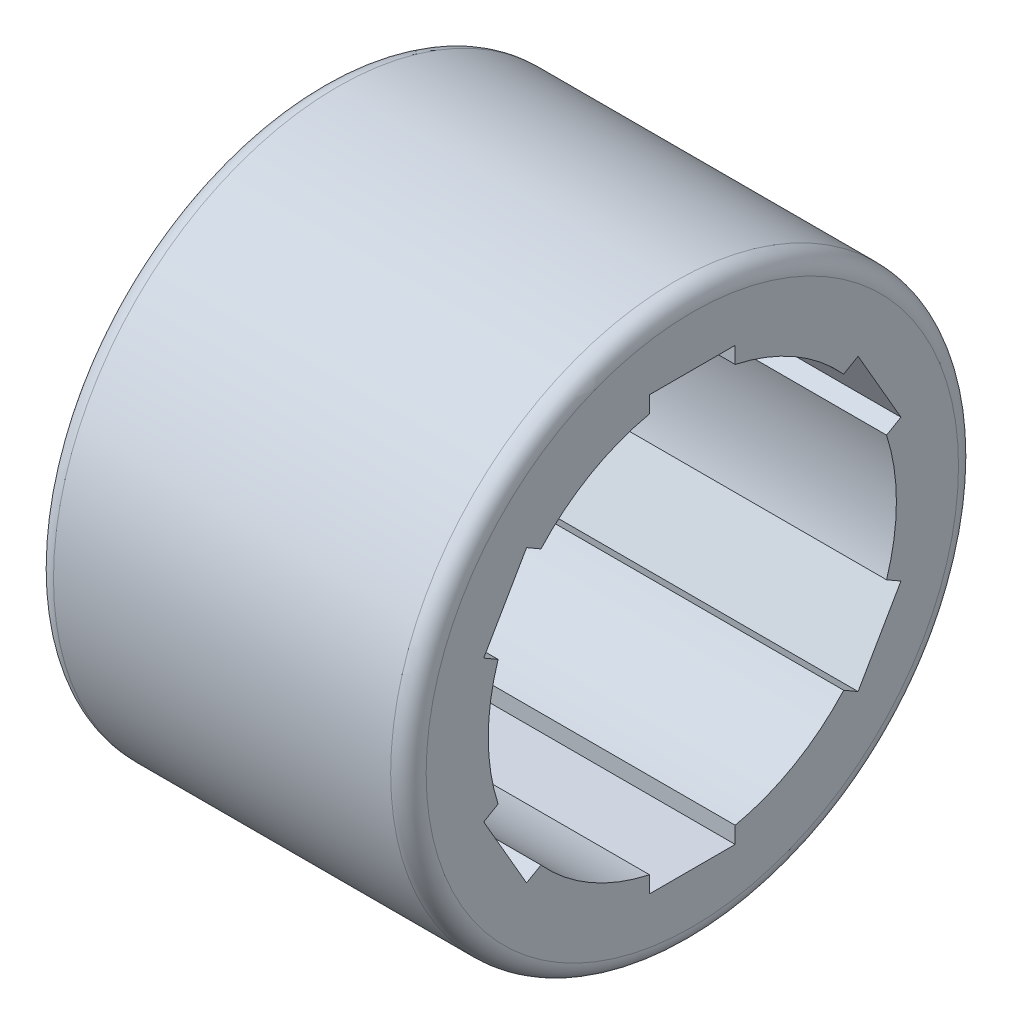
ISO-10303-21;
HEADER;
FILE_DESCRIPTION(('STEP AP214'),'2;1');
FILE_NAME('part.step','',(''),(''),'','','');
FILE_SCHEMA(('AUTOMOTIVE_DESIGN { 1 0 10303 214 1 1 1 1 }'));
ENDSEC;
DATA;
#1=APPLICATION_CONTEXT('core data for automotive mechanical design processes');
#2=APPLICATION_PROTOCOL_DEFINITION('international standard','automotive_design',2000,#1);
#3=PRODUCT_CONTEXT('',#1,'mechanical');
#4=PRODUCT('Part','Part','',(#3));
#5=PRODUCT_RELATED_PRODUCT_CATEGORY('part','',(#4));
#6=PRODUCT_DEFINITION_FORMATION('','',#4);
#7=PRODUCT_DEFINITION_CONTEXT('part definition',#1,'design');
#8=PRODUCT_DEFINITION('design','',#6,#7);
#9=PRODUCT_DEFINITION_SHAPE('','',#8);
#10=(LENGTH_UNIT() NAMED_UNIT(*) SI_UNIT(.MILLI.,.METRE.));
#11=(NAMED_UNIT(*) PLANE_ANGLE_UNIT() SI_UNIT($,.RADIAN.));
#12=(NAMED_UNIT(*) SI_UNIT($,.STERADIAN.) SOLID_ANGLE_UNIT());
#13=UNCERTAINTY_MEASURE_WITH_UNIT(LENGTH_MEASURE(1.E-05),#10,'distance_accuracy_value','');
#14=(GEOMETRIC_REPRESENTATION_CONTEXT(3) GLOBAL_UNCERTAINTY_ASSIGNED_CONTEXT((#13)) GLOBAL_UNIT_ASSIGNED_CONTEXT((#10,
#11,#12)) REPRESENTATION_CONTEXT('',''));
#15=CARTESIAN_POINT('',(0.,0.,0.));
#16=DIRECTION('',(0.,0.,1.));
#17=DIRECTION('',(1.,0.,0.));
#18=AXIS2_PLACEMENT_3D('',#15,#16,#17);
#19=CARTESIAN_POINT('',(21.,0.,0.));
#20=DIRECTION('',(1.,0.,0.));
#21=DIRECTION('',(0.,0.,-1.));
#22=AXIS2_PLACEMENT_3D('',#19,#20,#21);
#23=PLANE('',#22);
#24=CARTESIAN_POINT('',(21.,0.,0.));
#25=DIRECTION('',(1.,0.,0.));
#26=DIRECTION('',(0.,0.,-1.));
#27=AXIS2_PLACEMENT_3D('',#24,#25,#26);
#28=CIRCLE('',#27,15.);
#29=CARTESIAN_POINT('',(21.,0.,-15.));
#30=VERTEX_POINT('',#29);
#31=EDGE_CURVE('E11',#30,#30,#28,.T.);
#32=ORIENTED_EDGE('',*,*,#31,.T.);
#33=EDGE_LOOP('',(#32));
#34=FACE_BOUND('',#33,.T.);
#35=DIRECTION('',(0.,0.500000000000001,-0.866025403784438));
#36=VECTOR('',#35,1.);
#37=CARTESIAN_POINT('',(21.,3.53033161881354,-10.9447137313502));
#38=LINE('',#37,#36);
#39=CARTESIAN_POINT('',(21.,3.53033161881354,-10.9447137313502));
#40=VERTEX_POINT('',#39);
#41=CARTESIAN_POINT('',(21.,3.99854864986181,-11.7556894180949));
#42=VERTEX_POINT('',#41);
#43=EDGE_CURVE('E204',#40,#42,#38,.T.);
#44=ORIENTED_EDGE('',*,*,#43,.F.);
#45=CARTESIAN_POINT('',(21.,0.,0.));
#46=DIRECTION('',(1.,0.,0.));
#47=DIRECTION('',(0.,0.,-1.));
#48=AXIS2_PLACEMENT_3D('',#45,#46,#47);
#49=CIRCLE('',#48,11.5);
#50=CARTESIAN_POINT('',(21.,-3.53033161881061,-10.9447137313511));
#51=VERTEX_POINT('',#50);
#52=EDGE_CURVE('E196',#51,#40,#49,.T.);
#53=ORIENTED_EDGE('',*,*,#52,.F.);
#54=DIRECTION('',(0.,0.5,0.866025403784439));
#55=VECTOR('',#54,1.);
#56=CARTESIAN_POINT('',(21.,-3.53033161881061,-10.9447137313511));
#57=LINE('',#56,#55);
#58=CARTESIAN_POINT('',(21.,-3.99854864985908,-11.7556894180961));
#59=VERTEX_POINT('',#58);
#60=EDGE_CURVE('E261',#59,#51,#57,.T.);
#61=ORIENTED_EDGE('',*,*,#60,.F.);
#62=DIRECTION('',(0.,0.866025403784439,-0.5));
#63=VECTOR('',#62,1.);
#64=CARTESIAN_POINT('',(21.,-3.99854864985908,-11.7556894180961));
#65=LINE('',#64,#63);
#66=CARTESIAN_POINT('',(21.,-8.18145135013792,-9.34068941809613));
#67=VERTEX_POINT('',#66);
#68=EDGE_CURVE('E259',#67,#59,#65,.T.);
#69=ORIENTED_EDGE('',*,*,#68,.F.);
#70=DIRECTION('',(0.,-0.500000000000001,-0.866025403784438));
#71=VECTOR('',#70,1.);
#72=CARTESIAN_POINT('',(21.,-7.71323431908991,-8.52971373135193));
#73=LINE('',#72,#71);
#74=CARTESIAN_POINT('',(21.,-7.71323431908991,-8.52971373135193));
#75=VERTEX_POINT('',#74);
#76=EDGE_CURVE('E257',#75,#67,#73,.T.);
#77=ORIENTED_EDGE('',*,*,#76,.F.);
#78=CARTESIAN_POINT('',(21.,0.,0.));
#79=DIRECTION('',(1.,0.,0.));
#80=DIRECTION('',(0.,0.,-1.));
#81=AXIS2_PLACEMENT_3D('',#78,#79,#80);
#82=CIRCLE('',#81,11.5);
#83=CARTESIAN_POINT('',(21.,-11.2435659379037,-2.41500000000254));
#84=VERTEX_POINT('',#83);
#85=EDGE_CURVE('E255',#84,#75,#82,.T.);
#86=ORIENTED_EDGE('',*,*,#85,.F.);
#87=DIRECTION('',(0.,1.,0.));
#88=VECTOR('',#87,1.);
#89=CARTESIAN_POINT('',(21.,-11.2435659379037,-2.41500000000253));
#90=LINE('',#89,#88);
#91=CARTESIAN_POINT('',(21.,-12.1799999999995,-2.41500000000253));
#92=VERTEX_POINT('',#91);
#93=EDGE_CURVE('E253',#92,#84,#90,.T.);
#94=ORIENTED_EDGE('',*,*,#93,.F.);
#95=DIRECTION('',(0.,0.,-1.));
#96=VECTOR('',#95,1.);
#97=CARTESIAN_POINT('',(21.,-12.1799999999995,-2.41500000000253));
#98=LINE('',#97,#96);
#99=CARTESIAN_POINT('',(21.,-12.1799999999995,2.41499999999747));
#100=VERTEX_POINT('',#99);
#101=EDGE_CURVE('E251',#100,#92,#98,.T.);
#102=ORIENTED_EDGE('',*,*,#101,.F.);
#103=DIRECTION('',(0.,-1.,0.));
#104=VECTOR('',#103,1.);
#105=CARTESIAN_POINT('',(21.,-11.2435659379048,2.41499999999747));
#106=LINE('',#105,#104);
#107=CARTESIAN_POINT('',(21.,-11.2435659379048,2.41499999999747));
#108=VERTEX_POINT('',#107);
#109=EDGE_CURVE('E249',#108,#100,#106,.T.);
#110=ORIENTED_EDGE('',*,*,#109,.F.);
#111=CARTESIAN_POINT('',(21.,0.,0.));
#112=DIRECTION('',(1.,0.,0.));
#113=DIRECTION('',(0.,0.,-1.));
#114=AXIS2_PLACEMENT_3D('',#111,#112,#113);
#115=CIRCLE('',#114,11.5);
#116=CARTESIAN_POINT('',(21.,-7.7132343190928,8.52971373134932));
#117=VERTEX_POINT('',#116);
#118=EDGE_CURVE('E247',#117,#108,#115,.T.);
#119=ORIENTED_EDGE('',*,*,#118,.F.);
#120=DIRECTION('',(0.,0.5,-0.866025403784439));
#121=VECTOR('',#120,1.);
#122=CARTESIAN_POINT('',(21.,-7.7132343190928,8.52971373134931));
#123=LINE('',#122,#121);
#124=CARTESIAN_POINT('',(21.,-8.18145135014012,9.34068941809233));
#125=VERTEX_POINT('',#124);
#126=EDGE_CURVE('E245',#125,#117,#123,.T.);
#127=ORIENTED_EDGE('',*,*,#126,.F.);
#128=DIRECTION('',(0.,-0.866025403784438,-0.500000000000001));
#129=VECTOR('',#128,1.);
#130=CARTESIAN_POINT('',(21.,-8.18145135014012,9.34068941809233));
#131=LINE('',#130,#129);
#132=CARTESIAN_POINT('',(21.,-3.99854864986128,11.7556894180923));
#133=VERTEX_POINT('',#132);
#134=EDGE_CURVE('E243',#133,#125,#131,.T.);
#135=ORIENTED_EDGE('',*,*,#134,.F.);
#136=DIRECTION('',(0.,-0.499999999999999,0.866025403784439));
#137=VECTOR('',#136,1.);
#138=CARTESIAN_POINT('',(21.,-3.53033161881432,10.9447137313499));
#139=LINE('',#138,#137);
#140=CARTESIAN_POINT('',(21.,-3.53033161881432,10.9447137313499));
#141=VERTEX_POINT('',#140);
#142=EDGE_CURVE('E241',#141,#133,#139,.T.);
#143=ORIENTED_EDGE('',*,*,#142,.F.);
#144=CARTESIAN_POINT('',(21.,0.,0.));
#145=DIRECTION('',(1.,0.,0.));
#146=DIRECTION('',(0.,0.,-1.));
#147=AXIS2_PLACEMENT_3D('',#144,#145,#146);
#148=CIRCLE('',#147,11.5);
#149=CARTESIAN_POINT('',(21.,3.53033161881229,10.9447137313506));
#150=VERTEX_POINT('',#149);
#151=EDGE_CURVE('E239',#150,#141,#148,.T.);
#152=ORIENTED_EDGE('',*,*,#151,.F.);
#153=DIRECTION('',(0.,-0.5,-0.866025403784438));
#154=VECTOR('',#153,1.);
#155=CARTESIAN_POINT('',(21.,3.53033161881229,10.9447137313506));
#156=LINE('',#155,#154);
#157=CARTESIAN_POINT('',(21.,3.99854864985961,11.7556894180936));
#158=VERTEX_POINT('',#157);
#159=EDGE_CURVE('E237',#158,#150,#156,.T.);
#160=ORIENTED_EDGE('',*,*,#159,.F.);
#161=DIRECTION('',(0.,-0.866025403784439,0.499999999999999));
#162=VECTOR('',#161,1.);
#163=CARTESIAN_POINT('',(21.,3.99854864985961,11.7556894180936));
#164=LINE('',#163,#162);
#165=CARTESIAN_POINT('',(21.,8.18145135013845,9.3406894180936));
#166=VERTEX_POINT('',#165);
#167=EDGE_CURVE('E235',#166,#158,#164,.T.);
#168=ORIENTED_EDGE('',*,*,#167,.F.);
#169=DIRECTION('',(0.,0.5,0.866025403784439));
#170=VECTOR('',#169,1.);
#171=CARTESIAN_POINT('',(21.,7.71323431909122,8.52971373135074));
#172=LINE('',#171,#170);
#173=CARTESIAN_POINT('',(21.,7.71323431909122,8.52971373135074));
#174=VERTEX_POINT('',#173);
#175=EDGE_CURVE('E233',#174,#166,#172,.T.);
#176=ORIENTED_EDGE('',*,*,#175,.F.);
#177=CARTESIAN_POINT('',(21.,0.,0.));
#178=DIRECTION('',(1.,0.,0.));
#179=DIRECTION('',(0.,0.,-1.));
#180=AXIS2_PLACEMENT_3D('',#177,#178,#179);
#181=CIRCLE('',#180,11.5);
#182=CARTESIAN_POINT('',(21.,11.2435659379042,2.415));
#183=VERTEX_POINT('',#182);
#184=EDGE_CURVE('E231',#183,#174,#181,.T.);
#185=ORIENTED_EDGE('',*,*,#184,.F.);
#186=DIRECTION('',(0.,-1.,0.));
#187=VECTOR('',#186,1.);
#188=CARTESIAN_POINT('',(21.,11.2435659379042,2.415));
#189=LINE('',#188,#187);
#190=CARTESIAN_POINT('',(21.,12.18,2.415));
#191=VERTEX_POINT('',#190);
#192=EDGE_CURVE('E229',#191,#183,#189,.T.);
#193=ORIENTED_EDGE('',*,*,#192,.F.);
#194=DIRECTION('',(0.,0.,1.));
#195=VECTOR('',#194,1.);
#196=CARTESIAN_POINT('',(21.,12.18,2.415));
#197=LINE('',#196,#195);
#198=CARTESIAN_POINT('',(21.,12.18,-2.415));
#199=VERTEX_POINT('',#198);
#200=EDGE_CURVE('E227',#199,#191,#197,.T.);
#201=ORIENTED_EDGE('',*,*,#200,.F.);
#202=DIRECTION('',(0.,1.,0.));
#203=VECTOR('',#202,1.);
#204=CARTESIAN_POINT('',(21.,11.2435659379042,-2.415));
#205=LINE('',#204,#203);
#206=CARTESIAN_POINT('',(21.,11.2435659379042,-2.415));
#207=VERTEX_POINT('',#206);
#208=EDGE_CURVE('E225',#207,#199,#205,.T.);
#209=ORIENTED_EDGE('',*,*,#208,.F.);
#210=CARTESIAN_POINT('',(21.,0.,0.));
#211=DIRECTION('',(1.,0.,0.));
#212=DIRECTION('',(0.,0.,-1.));
#213=AXIS2_PLACEMENT_3D('',#210,#211,#212);
#214=CIRCLE('',#213,11.5);
#215=CARTESIAN_POINT('',(21.,7.71323431909219,-8.52971373134987));
#216=VERTEX_POINT('',#215);
#217=EDGE_CURVE('E223',#216,#207,#214,.T.);
#218=ORIENTED_EDGE('',*,*,#217,.F.);
#219=DIRECTION('',(0.,-0.5,0.866025403784439));
#220=VECTOR('',#219,1.);
#221=CARTESIAN_POINT('',(21.,7.71323431909219,-8.52971373134987));
#222=LINE('',#221,#220);
#223=CARTESIAN_POINT('',(21.,8.18145135014065,-9.34068941809486));
#224=VERTEX_POINT('',#223);
#225=EDGE_CURVE('E219',#224,#216,#222,.T.);
#226=ORIENTED_EDGE('',*,*,#225,.F.);
#227=DIRECTION('',(0.,0.866025403784438,0.5));
#228=VECTOR('',#227,1.);
#229=CARTESIAN_POINT('',(21.,8.18145135014065,-9.34068941809486));
#230=LINE('',#229,#228);
#231=EDGE_CURVE('E217',#42,#224,#230,.T.);
#232=ORIENTED_EDGE('',*,*,#231,.F.);
#233=EDGE_LOOP('',(#44,#53,#61,#69,#77,#86,#94,#102,#110,#119,#127,#135,#143,#152,#160,#168,
#176,#185,#193,#201,#209,#218,#226,#232));
#234=FACE_BOUND('',#233,.T.);
#235=ADVANCED_FACE('F35',(#34,#234),#23,.T.);
#236=CARTESIAN_POINT('',(0.,0.,0.));
#237=DIRECTION('',(1.,0.,0.));
#238=DIRECTION('',(0.,0.,-1.));
#239=AXIS2_PLACEMENT_3D('',#236,#237,#238);
#240=PLANE('',#239);
#241=CARTESIAN_POINT('',(0.,0.,0.));
#242=DIRECTION('',(1.,0.,0.));
#243=DIRECTION('',(0.,0.,-1.));
#244=AXIS2_PLACEMENT_3D('',#241,#242,#243);
#245=CIRCLE('',#244,15.);
#246=CARTESIAN_POINT('',(0.,0.,-15.));
#247=VERTEX_POINT('',#246);
#248=EDGE_CURVE('E43',#247,#247,#245,.F.);
#249=ORIENTED_EDGE('',*,*,#248,.T.);
#250=EDGE_LOOP('',(#249));
#251=FACE_BOUND('',#250,.T.);
#252=CARTESIAN_POINT('',(0.,0.,0.));
#253=DIRECTION('',(1.,0.,0.));
#254=DIRECTION('',(0.,0.,-1.));
#255=AXIS2_PLACEMENT_3D('',#252,#253,#254);
#256=CIRCLE('',#255,11.5);
#257=CARTESIAN_POINT('',(0.,-3.53033161881061,-10.9447137313511));
#258=VERTEX_POINT('',#257);
#259=CARTESIAN_POINT('',(0.,3.53033161881354,-10.9447137313502));
#260=VERTEX_POINT('',#259);
#261=EDGE_CURVE('E58',#258,#260,#256,.T.);
#262=ORIENTED_EDGE('',*,*,#261,.T.);
#263=DIRECTION('',(0.,0.500000000000001,-0.866025403784438));
#264=VECTOR('',#263,1.);
#265=CARTESIAN_POINT('',(0.,3.53033161881354,-10.9447137313502));
#266=LINE('',#265,#264);
#267=CARTESIAN_POINT('',(0.,3.99854864986181,-11.7556894180949));
#268=VERTEX_POINT('',#267);
#269=EDGE_CURVE('E211',#260,#268,#266,.T.);
#270=ORIENTED_EDGE('',*,*,#269,.T.);
#271=DIRECTION('',(0.,0.866025403784438,0.5));
#272=VECTOR('',#271,1.);
#273=CARTESIAN_POINT('',(0.,8.18145135014065,-9.34068941809486));
#274=LINE('',#273,#272);
#275=CARTESIAN_POINT('',(0.,8.18145135014065,-9.34068941809486));
#276=VERTEX_POINT('',#275);
#277=EDGE_CURVE('E265',#268,#276,#274,.T.);
#278=ORIENTED_EDGE('',*,*,#277,.T.);
#279=DIRECTION('',(0.,-0.5,0.866025403784439));
#280=VECTOR('',#279,1.);
#281=CARTESIAN_POINT('',(0.,7.71323431909219,-8.52971373134987));
#282=LINE('',#281,#280);
#283=CARTESIAN_POINT('',(0.,7.71323431909219,-8.52971373134987));
#284=VERTEX_POINT('',#283);
#285=EDGE_CURVE('E268',#276,#284,#282,.T.);
#286=ORIENTED_EDGE('',*,*,#285,.T.);
#287=CARTESIAN_POINT('',(0.,0.,0.));
#288=DIRECTION('',(1.,0.,0.));
#289=DIRECTION('',(0.,0.,-1.));
#290=AXIS2_PLACEMENT_3D('',#287,#288,#289);
#291=CIRCLE('',#290,11.5);
#292=CARTESIAN_POINT('',(0.,11.2435659379042,-2.415));
#293=VERTEX_POINT('',#292);
#294=EDGE_CURVE('E271',#284,#293,#291,.T.);
#295=ORIENTED_EDGE('',*,*,#294,.T.);
#296=DIRECTION('',(0.,1.,0.));
#297=VECTOR('',#296,1.);
#298=CARTESIAN_POINT('',(0.,11.2435659379042,-2.415));
#299=LINE('',#298,#297);
#300=CARTESIAN_POINT('',(0.,12.18,-2.415));
#301=VERTEX_POINT('',#300);
#302=EDGE_CURVE('E274',#293,#301,#299,.T.);
#303=ORIENTED_EDGE('',*,*,#302,.T.);
#304=DIRECTION('',(0.,0.,1.));
#305=VECTOR('',#304,1.);
#306=CARTESIAN_POINT('',(0.,12.18,2.415));
#307=LINE('',#306,#305);
#308=CARTESIAN_POINT('',(0.,12.18,2.415));
#309=VERTEX_POINT('',#308);
#310=EDGE_CURVE('E277',#301,#309,#307,.T.);
#311=ORIENTED_EDGE('',*,*,#310,.T.);
#312=DIRECTION('',(0.,-1.,0.));
#313=VECTOR('',#312,1.);
#314=CARTESIAN_POINT('',(0.,11.2435659379042,2.415));
#315=LINE('',#314,#313);
#316=CARTESIAN_POINT('',(0.,11.2435659379042,2.415));
#317=VERTEX_POINT('',#316);
#318=EDGE_CURVE('E280',#309,#317,#315,.T.);
#319=ORIENTED_EDGE('',*,*,#318,.T.);
#320=CARTESIAN_POINT('',(0.,0.,0.));
#321=DIRECTION('',(1.,0.,0.));
#322=DIRECTION('',(0.,0.,-1.));
#323=AXIS2_PLACEMENT_3D('',#320,#321,#322);
#324=CIRCLE('',#323,11.5);
#325=CARTESIAN_POINT('',(0.,7.71323431909122,8.52971373135074));
#326=VERTEX_POINT('',#325);
#327=EDGE_CURVE('E283',#317,#326,#324,.T.);
#328=ORIENTED_EDGE('',*,*,#327,.T.);
#329=DIRECTION('',(0.,0.5,0.866025403784439));
#330=VECTOR('',#329,1.);
#331=CARTESIAN_POINT('',(0.,7.71323431909122,8.52971373135074));
#332=LINE('',#331,#330);
#333=CARTESIAN_POINT('',(0.,8.18145135013845,9.3406894180936));
#334=VERTEX_POINT('',#333);
#335=EDGE_CURVE('E286',#326,#334,#332,.T.);
#336=ORIENTED_EDGE('',*,*,#335,.T.);
#337=DIRECTION('',(0.,-0.866025403784439,0.499999999999999));
#338=VECTOR('',#337,1.);
#339=CARTESIAN_POINT('',(0.,3.99854864985961,11.7556894180936));
#340=LINE('',#339,#338);
#341=CARTESIAN_POINT('',(0.,3.99854864985961,11.7556894180936));
#342=VERTEX_POINT('',#341);
#343=EDGE_CURVE('E289',#334,#342,#340,.T.);
#344=ORIENTED_EDGE('',*,*,#343,.T.);
#345=DIRECTION('',(0.,-0.5,-0.866025403784438));
#346=VECTOR('',#345,1.);
#347=CARTESIAN_POINT('',(0.,3.53033161881229,10.9447137313506));
#348=LINE('',#347,#346);
#349=CARTESIAN_POINT('',(0.,3.53033161881229,10.9447137313506));
#350=VERTEX_POINT('',#349);
#351=EDGE_CURVE('E292',#342,#350,#348,.T.);
#352=ORIENTED_EDGE('',*,*,#351,.T.);
#353=CARTESIAN_POINT('',(0.,0.,0.));
#354=DIRECTION('',(1.,0.,0.));
#355=DIRECTION('',(0.,0.,-1.));
#356=AXIS2_PLACEMENT_3D('',#353,#354,#355);
#357=CIRCLE('',#356,11.5);
#358=CARTESIAN_POINT('',(0.,-3.53033161881432,10.9447137313499));
#359=VERTEX_POINT('',#358);
#360=EDGE_CURVE('E295',#350,#359,#357,.T.);
#361=ORIENTED_EDGE('',*,*,#360,.T.);
#362=DIRECTION('',(0.,-0.499999999999999,0.866025403784439));
#363=VECTOR('',#362,1.);
#364=CARTESIAN_POINT('',(0.,-3.53033161881432,10.9447137313499));
#365=LINE('',#364,#363);
#366=CARTESIAN_POINT('',(0.,-3.99854864986128,11.7556894180923));
#367=VERTEX_POINT('',#366);
#368=EDGE_CURVE('E298',#359,#367,#365,.T.);
#369=ORIENTED_EDGE('',*,*,#368,.T.);
#370=DIRECTION('',(0.,-0.866025403784438,-0.500000000000001));
#371=VECTOR('',#370,1.);
#372=CARTESIAN_POINT('',(0.,-8.18145135014012,9.34068941809233));
#373=LINE('',#372,#371);
#374=CARTESIAN_POINT('',(0.,-8.18145135014012,9.34068941809233));
#375=VERTEX_POINT('',#374);
#376=EDGE_CURVE('E301',#367,#375,#373,.T.);
#377=ORIENTED_EDGE('',*,*,#376,.T.);
#378=DIRECTION('',(0.,0.5,-0.866025403784439));
#379=VECTOR('',#378,1.);
#380=CARTESIAN_POINT('',(0.,-7.7132343190928,8.52971373134931));
#381=LINE('',#380,#379);
#382=CARTESIAN_POINT('',(0.,-7.7132343190928,8.52971373134932));
#383=VERTEX_POINT('',#382);
#384=EDGE_CURVE('E304',#375,#383,#381,.T.);
#385=ORIENTED_EDGE('',*,*,#384,.T.);
#386=CARTESIAN_POINT('',(0.,0.,0.));
#387=DIRECTION('',(1.,0.,0.));
#388=DIRECTION('',(0.,0.,-1.));
#389=AXIS2_PLACEMENT_3D('',#386,#387,#388);
#390=CIRCLE('',#389,11.5);
#391=CARTESIAN_POINT('',(0.,-11.2435659379048,2.41499999999747));
#392=VERTEX_POINT('',#391);
#393=EDGE_CURVE('E307',#383,#392,#390,.T.);
#394=ORIENTED_EDGE('',*,*,#393,.T.);
#395=DIRECTION('',(0.,-1.,0.));
#396=VECTOR('',#395,1.);
#397=CARTESIAN_POINT('',(0.,-11.2435659379048,2.41499999999747));
#398=LINE('',#397,#396);
#399=CARTESIAN_POINT('',(0.,-12.1799999999995,2.41499999999747));
#400=VERTEX_POINT('',#399);
#401=EDGE_CURVE('E310',#392,#400,#398,.T.);
#402=ORIENTED_EDGE('',*,*,#401,.T.);
#403=DIRECTION('',(0.,0.,-1.));
#404=VECTOR('',#403,1.);
#405=CARTESIAN_POINT('',(0.,-12.1799999999995,-2.41500000000253));
#406=LINE('',#405,#404);
#407=CARTESIAN_POINT('',(0.,-12.1799999999995,-2.41500000000253));
#408=VERTEX_POINT('',#407);
#409=EDGE_CURVE('E313',#400,#408,#406,.T.);
#410=ORIENTED_EDGE('',*,*,#409,.T.);
#411=DIRECTION('',(0.,1.,0.));
#412=VECTOR('',#411,1.);
#413=CARTESIAN_POINT('',(0.,-11.2435659379037,-2.41500000000253));
#414=LINE('',#413,#412);
#415=CARTESIAN_POINT('',(0.,-11.2435659379037,-2.41500000000254));
#416=VERTEX_POINT('',#415);
#417=EDGE_CURVE('E316',#408,#416,#414,.T.);
#418=ORIENTED_EDGE('',*,*,#417,.T.);
#419=CARTESIAN_POINT('',(0.,0.,0.));
#420=DIRECTION('',(1.,0.,0.));
#421=DIRECTION('',(0.,0.,-1.));
#422=AXIS2_PLACEMENT_3D('',#419,#420,#421);
#423=CIRCLE('',#422,11.5);
#424=CARTESIAN_POINT('',(0.,-7.71323431908991,-8.52971373135193));
#425=VERTEX_POINT('',#424);
#426=EDGE_CURVE('E319',#416,#425,#423,.T.);
#427=ORIENTED_EDGE('',*,*,#426,.T.);
#428=DIRECTION('',(0.,-0.500000000000001,-0.866025403784438));
#429=VECTOR('',#428,1.);
#430=CARTESIAN_POINT('',(0.,-7.71323431908991,-8.52971373135193));
#431=LINE('',#430,#429);
#432=CARTESIAN_POINT('',(0.,-8.18145135013792,-9.34068941809613));
#433=VERTEX_POINT('',#432);
#434=EDGE_CURVE('E322',#425,#433,#431,.T.);
#435=ORIENTED_EDGE('',*,*,#434,.T.);
#436=DIRECTION('',(0.,0.866025403784439,-0.5));
#437=VECTOR('',#436,1.);
#438=CARTESIAN_POINT('',(0.,-3.99854864985908,-11.7556894180961));
#439=LINE('',#438,#437);
#440=CARTESIAN_POINT('',(0.,-3.99854864985908,-11.7556894180961));
#441=VERTEX_POINT('',#440);
#442=EDGE_CURVE('E325',#433,#441,#439,.T.);
#443=ORIENTED_EDGE('',*,*,#442,.T.);
#444=DIRECTION('',(0.,0.5,0.866025403784439));
#445=VECTOR('',#444,1.);
#446=CARTESIAN_POINT('',(0.,-3.53033161881061,-10.9447137313511));
#447=LINE('',#446,#445);
#448=EDGE_CURVE('E205',#441,#258,#447,.T.);
#449=ORIENTED_EDGE('',*,*,#448,.T.);
#450=EDGE_LOOP('',(#262,#270,#278,#286,#295,#303,#311,#319,#328,#336,#344,#352,#361,#369,#377,
#385,#394,#402,#410,#418,#427,#435,#443,#449));
#451=FACE_BOUND('',#450,.T.);
#452=ADVANCED_FACE('F380',(#251,#451),#240,.F.);
#453=CARTESIAN_POINT('',(21.,0.,0.));
#454=DIRECTION('',(-1.,0.,0.));
#455=DIRECTION('',(0.,0.,1.));
#456=AXIS2_PLACEMENT_3D('',#453,#454,#455);
#457=CYLINDRICAL_SURFACE('',#456,16.);
#458=CARTESIAN_POINT('',(1.,0.,0.));
#459=DIRECTION('',(1.,0.,0.));
#460=DIRECTION('',(0.,0.,-1.));
#461=AXIS2_PLACEMENT_3D('',#458,#459,#460);
#462=CIRCLE('',#461,16.);
#463=CARTESIAN_POINT('',(1.,0.,16.));
#464=VERTEX_POINT('',#463);
#465=EDGE_CURVE('E375',#464,#464,#462,.T.);
#466=CARTESIAN_POINT('',(20.,0.,0.));
#467=DIRECTION('',(1.,0.,0.));
#468=DIRECTION('',(0.,0.,-1.));
#469=AXIS2_PLACEMENT_3D('',#466,#467,#468);
#470=CIRCLE('',#469,16.);
#471=CARTESIAN_POINT('',(20.,0.,16.));
#472=VERTEX_POINT('',#471);
#473=EDGE_CURVE('E212',#472,#472,#470,.F.);
#474=CARTESIAN_POINT('',(1.,0.,16.));
#475=CARTESIAN_POINT('',(1.19791666666667,0.,16.));
#476=CARTESIAN_POINT('',(1.39583333333333,0.,16.));
#477=CARTESIAN_POINT('',(1.79166666666667,0.,16.));
#478=CARTESIAN_POINT('',(1.98958333333334,0.,16.));
#479=CARTESIAN_POINT('',(2.38541666666667,0.,16.));
#480=CARTESIAN_POINT('',(2.58333333333334,0.,16.));
#481=CARTESIAN_POINT('',(2.97916666666667,0.,16.));
#482=CARTESIAN_POINT('',(3.17708333333334,0.,16.));
#483=CARTESIAN_POINT('',(3.57291666666667,0.,16.));
#484=CARTESIAN_POINT('',(3.77083333333333,0.,16.));
#485=CARTESIAN_POINT('',(4.16666666666667,0.,16.));
#486=CARTESIAN_POINT('',(4.36458333333333,0.,16.));
#487=CARTESIAN_POINT('',(4.76041666666667,0.,16.));
#488=CARTESIAN_POINT('',(4.95833333333333,0.,16.));
#489=CARTESIAN_POINT('',(5.35416666666667,0.,16.));
#490=CARTESIAN_POINT('',(5.55208333333333,0.,16.));
#491=CARTESIAN_POINT('',(5.94791666666667,0.,16.));
#492=CARTESIAN_POINT('',(6.14583333333333,0.,16.));
#493=CARTESIAN_POINT('',(6.54166666666667,0.,16.));
#494=CARTESIAN_POINT('',(6.73958333333333,0.,16.));
#495=CARTESIAN_POINT('',(7.13541666666667,0.,16.));
#496=CARTESIAN_POINT('',(7.33333333333333,0.,16.));
#497=CARTESIAN_POINT('',(7.72916666666667,0.,16.));
#498=CARTESIAN_POINT('',(7.92708333333333,0.,16.));
#499=CARTESIAN_POINT('',(8.32291666666667,0.,16.));
#500=CARTESIAN_POINT('',(8.52083333333333,0.,16.));
#501=CARTESIAN_POINT('',(8.91666666666667,0.,16.));
#502=CARTESIAN_POINT('',(9.11458333333333,0.,16.));
#503=CARTESIAN_POINT('',(9.51041666666667,0.,16.));
#504=CARTESIAN_POINT('',(9.70833333333333,0.,16.));
#505=CARTESIAN_POINT('',(10.1041666666667,0.,16.));
#506=CARTESIAN_POINT('',(10.3020833333333,0.,16.));
#507=CARTESIAN_POINT('',(10.6979166666667,0.,16.));
#508=CARTESIAN_POINT('',(10.8958333333333,0.,16.));
#509=CARTESIAN_POINT('',(11.2916666666667,0.,16.));
#510=CARTESIAN_POINT('',(11.4895833333333,0.,16.));
#511=CARTESIAN_POINT('',(11.8854166666667,0.,16.));
#512=CARTESIAN_POINT('',(12.0833333333333,0.,16.));
#513=CARTESIAN_POINT('',(12.4791666666667,0.,16.));
#514=CARTESIAN_POINT('',(12.6770833333333,0.,16.));
#515=CARTESIAN_POINT('',(13.0729166666667,0.,16.));
#516=CARTESIAN_POINT('',(13.2708333333333,0.,16.));
#517=CARTESIAN_POINT('',(13.6666666666667,0.,16.));
#518=CARTESIAN_POINT('',(13.8645833333333,0.,16.));
#519=CARTESIAN_POINT('',(14.2604166666667,0.,16.));
#520=CARTESIAN_POINT('',(14.4583333333333,0.,16.));
#521=CARTESIAN_POINT('',(14.8541666666667,0.,16.));
#522=CARTESIAN_POINT('',(15.0520833333333,0.,16.));
#523=CARTESIAN_POINT('',(15.4479166666667,0.,16.));
#524=CARTESIAN_POINT('',(15.6458333333333,0.,16.));
#525=CARTESIAN_POINT('',(16.0416666666667,0.,16.));
#526=CARTESIAN_POINT('',(16.2395833333333,0.,16.));
#527=CARTESIAN_POINT('',(16.6354166666667,0.,16.));
#528=CARTESIAN_POINT('',(16.8333333333333,0.,16.));
#529=CARTESIAN_POINT('',(17.2291666666667,0.,16.));
#530=CARTESIAN_POINT('',(17.4270833333333,0.,16.));
#531=CARTESIAN_POINT('',(17.8229166666667,0.,16.));
#532=CARTESIAN_POINT('',(18.0208333333333,0.,16.));
#533=CARTESIAN_POINT('',(18.4166666666667,0.,16.));
#534=CARTESIAN_POINT('',(18.6145833333333,0.,16.));
#535=CARTESIAN_POINT('',(19.0104166666667,0.,16.));
#536=CARTESIAN_POINT('',(19.2083333333333,0.,16.));
#537=CARTESIAN_POINT('',(19.6041666666667,0.,16.));
#538=CARTESIAN_POINT('',(19.8020833333333,0.,16.));
#539=CARTESIAN_POINT('',(20.,0.,16.));
#540=B_SPLINE_CURVE_WITH_KNOTS('',3,(#474,#475,#476,#477,#478,#479,#480,#481,#482,#483,#484,
#485,#486,#487,#488,#489,#490,#491,#492,#493,#494,#495,#496,#497,#498,#499,#500,#501,#502,#503,
#504,#505,#506,#507,#508,#509,#510,#511,#512,#513,#514,#515,#516,#517,#518,#519,#520,#521,#522,
#523,#524,#525,#526,#527,#528,#529,#530,#531,#532,#533,#534,#535,#536,#537,#538,#539),
.UNSPECIFIED.,.F.,.F.,(4,2,2,2,2,2,2,2,2,2,2,2,2,2,2,2,2,2,2,2,2,2,2,2,2,2,2,2,2,2,2,2,4),(0.,
0.593750000000001,1.1875,1.78125,2.375,2.96875,3.5625,4.15625,4.75,5.34375,5.9375,6.53125,7.125,
7.71875,8.3125,8.90625,9.5,10.09375,10.6875,11.28125,11.875,12.46875,13.0625,13.65625,14.25,
14.84375,15.4375,16.03125,16.625,17.21875,17.8125,18.40625,19.),.UNSPECIFIED.);
#541=EDGE_CURVE('BSEAM389',#464,#472,#540,.T.);
#542=ORIENTED_EDGE('',*,*,#465,.T.);
#543=ORIENTED_EDGE('',*,*,#473,.T.);
#544=ORIENTED_EDGE('',*,*,#541,.T.);
#545=ORIENTED_EDGE('',*,*,#541,.F.);
#546=EDGE_LOOP('',(#542,#544,#543,#545));
#547=FACE_BOUND('',#546,.T.);
#548=ADVANCED_FACE('F389',(#547),#457,.T.);
#549=CARTESIAN_POINT('',(21.,0.,0.));
#550=DIRECTION('',(-1.,0.,0.));
#551=DIRECTION('',(0.,0.,1.));
#552=AXIS2_PLACEMENT_3D('',#549,#550,#551);
#553=CYLINDRICAL_SURFACE('',#552,11.5);
#554=ORIENTED_EDGE('',*,*,#261,.F.);
#555=DIRECTION('',(-1.,0.,0.));
#556=VECTOR('',#555,1.);
#557=CARTESIAN_POINT('',(21.,-3.53033161881061,-10.9447137313511));
#558=LINE('',#557,#556);
#559=EDGE_CURVE('E200',#51,#258,#558,.T.);
#560=ORIENTED_EDGE('',*,*,#559,.F.);
#561=ORIENTED_EDGE('',*,*,#52,.T.);
#562=DIRECTION('',(-1.,0.,0.));
#563=VECTOR('',#562,1.);
#564=CARTESIAN_POINT('',(21.,3.53033161881354,-10.9447137313502));
#565=LINE('',#564,#563);
#566=EDGE_CURVE('E199',#40,#260,#565,.T.);
#567=ORIENTED_EDGE('',*,*,#566,.T.);
#568=EDGE_LOOP('',(#554,#560,#561,#567));
#569=FACE_BOUND('',#568,.T.);
#570=ADVANCED_FACE('F198',(#569),#553,.F.);
#571=CARTESIAN_POINT('',(21.,3.53033161881354,-10.9447137313502));
#572=DIRECTION('',(0.,0.866025403784438,0.500000000000001));
#573=DIRECTION('',(0.,-0.500000000000001,0.866025403784438));
#574=AXIS2_PLACEMENT_3D('',#571,#572,#573);
#575=PLANE('',#574);
#576=ORIENTED_EDGE('',*,*,#269,.F.);
#577=ORIENTED_EDGE('',*,*,#566,.F.);
#578=ORIENTED_EDGE('',*,*,#43,.T.);
#579=DIRECTION('',(-1.,0.,0.));
#580=VECTOR('',#579,1.);
#581=CARTESIAN_POINT('',(21.,3.99854864986181,-11.7556894180949));
#582=LINE('',#581,#580);
#583=EDGE_CURVE('E213',#42,#268,#582,.T.);
#584=ORIENTED_EDGE('',*,*,#583,.T.);
#585=EDGE_LOOP('',(#576,#577,#578,#584));
#586=FACE_BOUND('',#585,.T.);
#587=ADVANCED_FACE('F208',(#586),#575,.T.);
#588=CARTESIAN_POINT('',(21.,8.18145135014065,-9.34068941809486));
#589=DIRECTION('',(0.,-0.5,0.866025403784438));
#590=DIRECTION('',(0.,-0.866025403784438,-0.5));
#591=AXIS2_PLACEMENT_3D('',#588,#589,#590);
#592=PLANE('',#591);
#593=ORIENTED_EDGE('',*,*,#277,.F.);
#594=ORIENTED_EDGE('',*,*,#583,.F.);
#595=ORIENTED_EDGE('',*,*,#231,.T.);
#596=DIRECTION('',(-1.,0.,0.));
#597=VECTOR('',#596,1.);
#598=CARTESIAN_POINT('',(21.,8.18145135014065,-9.34068941809486));
#599=LINE('',#598,#597);
#600=EDGE_CURVE('E370',#224,#276,#599,.T.);
#601=ORIENTED_EDGE('',*,*,#600,.T.);
#602=EDGE_LOOP('',(#593,#594,#595,#601));
#603=FACE_BOUND('',#602,.T.);
#604=ADVANCED_FACE('F410',(#603),#592,.T.);
#605=CARTESIAN_POINT('',(21.,7.71323431909219,-8.52971373134987));
#606=DIRECTION('',(0.,-0.866025403784439,-0.5));
#607=DIRECTION('',(0.,0.5,-0.866025403784439));
#608=AXIS2_PLACEMENT_3D('',#605,#606,#607);
#609=PLANE('',#608);
#610=ORIENTED_EDGE('',*,*,#285,.F.);
#611=ORIENTED_EDGE('',*,*,#600,.F.);
#612=ORIENTED_EDGE('',*,*,#225,.T.);
#613=DIRECTION('',(-1.,0.,0.));
#614=VECTOR('',#613,1.);
#615=CARTESIAN_POINT('',(21.,7.71323431909219,-8.52971373134987));
#616=LINE('',#615,#614);
#617=EDGE_CURVE('E368',#216,#284,#616,.T.);
#618=ORIENTED_EDGE('',*,*,#617,.T.);
#619=EDGE_LOOP('',(#610,#611,#612,#618));
#620=FACE_BOUND('',#619,.T.);
#621=ADVANCED_FACE('F413',(#620),#609,.T.);
#622=CARTESIAN_POINT('',(21.,0.,0.));
#623=DIRECTION('',(-1.,0.,0.));
#624=DIRECTION('',(0.,0.,1.));
#625=AXIS2_PLACEMENT_3D('',#622,#623,#624);
#626=CYLINDRICAL_SURFACE('',#625,11.5);
#627=ORIENTED_EDGE('',*,*,#294,.F.);
#628=ORIENTED_EDGE('',*,*,#617,.F.);
#629=ORIENTED_EDGE('',*,*,#217,.T.);
#630=DIRECTION('',(-1.,0.,0.));
#631=VECTOR('',#630,1.);
#632=CARTESIAN_POINT('',(21.,11.2435659379042,-2.415));
#633=LINE('',#632,#631);
#634=EDGE_CURVE('E366',#207,#293,#633,.T.);
#635=ORIENTED_EDGE('',*,*,#634,.T.);
#636=EDGE_LOOP('',(#627,#628,#629,#635));
#637=FACE_BOUND('',#636,.T.);
#638=ADVANCED_FACE('F417',(#637),#626,.F.);
#639=CARTESIAN_POINT('',(21.,11.2435659379042,-2.415));
#640=DIRECTION('',(0.,0.,1.));
#641=DIRECTION('',(1.,0.,0.));
#642=AXIS2_PLACEMENT_3D('',#639,#640,#641);
#643=PLANE('',#642);
#644=ORIENTED_EDGE('',*,*,#302,.F.);
#645=ORIENTED_EDGE('',*,*,#634,.F.);
#646=ORIENTED_EDGE('',*,*,#208,.T.);
#647=DIRECTION('',(-1.,0.,0.));
#648=VECTOR('',#647,1.);
#649=CARTESIAN_POINT('',(21.,12.18,-2.415));
#650=LINE('',#649,#648);
#651=EDGE_CURVE('E364',#199,#301,#650,.T.);
#652=ORIENTED_EDGE('',*,*,#651,.T.);
#653=EDGE_LOOP('',(#644,#645,#646,#652));
#654=FACE_BOUND('',#653,.T.);
#655=ADVANCED_FACE('F421',(#654),#643,.T.);
#656=CARTESIAN_POINT('',(21.,12.18,2.415));
#657=DIRECTION('',(0.,-1.,0.));
#658=DIRECTION('',(0.,0.,-1.));
#659=AXIS2_PLACEMENT_3D('',#656,#657,#658);
#660=PLANE('',#659);
#661=ORIENTED_EDGE('',*,*,#310,.F.);
#662=ORIENTED_EDGE('',*,*,#651,.F.);
#663=ORIENTED_EDGE('',*,*,#200,.T.);
#664=DIRECTION('',(-1.,0.,0.));
#665=VECTOR('',#664,1.);
#666=CARTESIAN_POINT('',(21.,12.18,2.415));
#667=LINE('',#666,#665);
#668=EDGE_CURVE('E362',#191,#309,#667,.T.);
#669=ORIENTED_EDGE('',*,*,#668,.T.);
#670=EDGE_LOOP('',(#661,#662,#663,#669));
#671=FACE_BOUND('',#670,.T.);
#672=ADVANCED_FACE('F425',(#671),#660,.T.);
#673=CARTESIAN_POINT('',(21.,11.2435659379042,2.415));
#674=DIRECTION('',(0.,0.,-1.));
#675=DIRECTION('',(-1.,0.,0.));
#676=AXIS2_PLACEMENT_3D('',#673,#674,#675);
#677=PLANE('',#676);
#678=ORIENTED_EDGE('',*,*,#318,.F.);
#679=ORIENTED_EDGE('',*,*,#668,.F.);
#680=ORIENTED_EDGE('',*,*,#192,.T.);
#681=DIRECTION('',(-1.,0.,0.));
#682=VECTOR('',#681,1.);
#683=CARTESIAN_POINT('',(21.,11.2435659379042,2.415));
#684=LINE('',#683,#682);
#685=EDGE_CURVE('E360',#183,#317,#684,.T.);
#686=ORIENTED_EDGE('',*,*,#685,.T.);
#687=EDGE_LOOP('',(#678,#679,#680,#686));
#688=FACE_BOUND('',#687,.T.);
#689=ADVANCED_FACE('F429',(#688),#677,.T.);
#690=CARTESIAN_POINT('',(21.,0.,0.));
#691=DIRECTION('',(-1.,0.,0.));
#692=DIRECTION('',(0.,0.,1.));
#693=AXIS2_PLACEMENT_3D('',#690,#691,#692);
#694=CYLINDRICAL_SURFACE('',#693,11.5);
#695=ORIENTED_EDGE('',*,*,#327,.F.);
#696=ORIENTED_EDGE('',*,*,#685,.F.);
#697=ORIENTED_EDGE('',*,*,#184,.T.);
#698=DIRECTION('',(-1.,0.,0.));
#699=VECTOR('',#698,1.);
#700=CARTESIAN_POINT('',(21.,7.71323431909122,8.52971373135074));
#701=LINE('',#700,#699);
#702=EDGE_CURVE('E358',#174,#326,#701,.T.);
#703=ORIENTED_EDGE('',*,*,#702,.T.);
#704=EDGE_LOOP('',(#695,#696,#697,#703));
#705=FACE_BOUND('',#704,.T.);
#706=ADVANCED_FACE('F433',(#705),#694,.F.);
#707=CARTESIAN_POINT('',(21.,7.71323431909122,8.52971373135074));
#708=DIRECTION('',(0.,-0.866025403784439,0.5));
#709=DIRECTION('',(0.,-0.5,-0.866025403784439));
#710=AXIS2_PLACEMENT_3D('',#707,#708,#709);
#711=PLANE('',#710);
#712=ORIENTED_EDGE('',*,*,#335,.F.);
#713=ORIENTED_EDGE('',*,*,#702,.F.);
#714=ORIENTED_EDGE('',*,*,#175,.T.);
#715=DIRECTION('',(-1.,0.,0.));
#716=VECTOR('',#715,1.);
#717=CARTESIAN_POINT('',(21.,8.18145135013845,9.3406894180936));
#718=LINE('',#717,#716);
#719=EDGE_CURVE('E356',#166,#334,#718,.T.);
#720=ORIENTED_EDGE('',*,*,#719,.T.);
#721=EDGE_LOOP('',(#712,#713,#714,#720));
#722=FACE_BOUND('',#721,.T.);
#723=ADVANCED_FACE('F437',(#722),#711,.T.);
#724=CARTESIAN_POINT('',(21.,3.99854864985961,11.7556894180936));
#725=DIRECTION('',(0.,-0.499999999999999,-0.866025403784439));
#726=DIRECTION('',(0.,0.866025403784439,-0.499999999999999));
#727=AXIS2_PLACEMENT_3D('',#724,#725,#726);
#728=PLANE('',#727);
#729=ORIENTED_EDGE('',*,*,#343,.F.);
#730=ORIENTED_EDGE('',*,*,#719,.F.);
#731=ORIENTED_EDGE('',*,*,#167,.T.);
#732=DIRECTION('',(-1.,0.,0.));
#733=VECTOR('',#732,1.);
#734=CARTESIAN_POINT('',(21.,3.99854864985961,11.7556894180936));
#735=LINE('',#734,#733);
#736=EDGE_CURVE('E354',#158,#342,#735,.T.);
#737=ORIENTED_EDGE('',*,*,#736,.T.);
#738=EDGE_LOOP('',(#729,#730,#731,#737));
#739=FACE_BOUND('',#738,.T.);
#740=ADVANCED_FACE('F441',(#739),#728,.T.);
#741=CARTESIAN_POINT('',(21.,3.53033161881229,10.9447137313506));
#742=DIRECTION('',(0.,0.866025403784438,-0.5));
#743=DIRECTION('',(0.,0.5,0.866025403784438));
#744=AXIS2_PLACEMENT_3D('',#741,#742,#743);
#745=PLANE('',#744);
#746=ORIENTED_EDGE('',*,*,#351,.F.);
#747=ORIENTED_EDGE('',*,*,#736,.F.);
#748=ORIENTED_EDGE('',*,*,#159,.T.);
#749=DIRECTION('',(-1.,0.,0.));
#750=VECTOR('',#749,1.);
#751=CARTESIAN_POINT('',(21.,3.53033161881229,10.9447137313506));
#752=LINE('',#751,#750);
#753=EDGE_CURVE('E352',#150,#350,#752,.T.);
#754=ORIENTED_EDGE('',*,*,#753,.T.);
#755=EDGE_LOOP('',(#746,#747,#748,#754));
#756=FACE_BOUND('',#755,.T.);
#757=ADVANCED_FACE('F445',(#756),#745,.T.);
#758=CARTESIAN_POINT('',(21.,0.,0.));
#759=DIRECTION('',(-1.,0.,0.));
#760=DIRECTION('',(0.,0.,1.));
#761=AXIS2_PLACEMENT_3D('',#758,#759,#760);
#762=CYLINDRICAL_SURFACE('',#761,11.5);
#763=ORIENTED_EDGE('',*,*,#360,.F.);
#764=ORIENTED_EDGE('',*,*,#753,.F.);
#765=ORIENTED_EDGE('',*,*,#151,.T.);
#766=DIRECTION('',(-1.,0.,0.));
#767=VECTOR('',#766,1.);
#768=CARTESIAN_POINT('',(21.,-3.53033161881432,10.9447137313499));
#769=LINE('',#768,#767);
#770=EDGE_CURVE('E350',#141,#359,#769,.T.);
#771=ORIENTED_EDGE('',*,*,#770,.T.);
#772=EDGE_LOOP('',(#763,#764,#765,#771));
#773=FACE_BOUND('',#772,.T.);
#774=ADVANCED_FACE('F449',(#773),#762,.F.);
#775=CARTESIAN_POINT('',(21.,-3.53033161881432,10.9447137313499));
#776=DIRECTION('',(0.,-0.866025403784439,-0.499999999999999));
#777=DIRECTION('',(0.,0.499999999999999,-0.866025403784439));
#778=AXIS2_PLACEMENT_3D('',#775,#776,#777);
#779=PLANE('',#778);
#780=ORIENTED_EDGE('',*,*,#368,.F.);
#781=ORIENTED_EDGE('',*,*,#770,.F.);
#782=ORIENTED_EDGE('',*,*,#142,.T.);
#783=DIRECTION('',(-1.,0.,0.));
#784=VECTOR('',#783,1.);
#785=CARTESIAN_POINT('',(21.,-3.99854864986128,11.7556894180923));
#786=LINE('',#785,#784);
#787=EDGE_CURVE('E348',#133,#367,#786,.T.);
#788=ORIENTED_EDGE('',*,*,#787,.T.);
#789=EDGE_LOOP('',(#780,#781,#782,#788));
#790=FACE_BOUND('',#789,.T.);
#791=ADVANCED_FACE('F453',(#790),#779,.T.);
#792=CARTESIAN_POINT('',(21.,-8.18145135014012,9.34068941809233));
#793=DIRECTION('',(0.,0.500000000000001,-0.866025403784438));
#794=DIRECTION('',(0.,0.866025403784438,0.500000000000001));
#795=AXIS2_PLACEMENT_3D('',#792,#793,#794);
#796=PLANE('',#795);
#797=ORIENTED_EDGE('',*,*,#376,.F.);
#798=ORIENTED_EDGE('',*,*,#787,.F.);
#799=ORIENTED_EDGE('',*,*,#134,.T.);
#800=DIRECTION('',(-1.,0.,0.));
#801=VECTOR('',#800,1.);
#802=CARTESIAN_POINT('',(21.,-8.18145135014012,9.34068941809233));
#803=LINE('',#802,#801);
#804=EDGE_CURVE('E346',#125,#375,#803,.T.);
#805=ORIENTED_EDGE('',*,*,#804,.T.);
#806=EDGE_LOOP('',(#797,#798,#799,#805));
#807=FACE_BOUND('',#806,.T.);
#808=ADVANCED_FACE('F457',(#807),#796,.T.);
#809=CARTESIAN_POINT('',(21.,-7.7132343190928,8.52971373134931));
#810=DIRECTION('',(0.,0.866025403784439,0.5));
#811=DIRECTION('',(0.,-0.5,0.866025403784439));
#812=AXIS2_PLACEMENT_3D('',#809,#810,#811);
#813=PLANE('',#812);
#814=ORIENTED_EDGE('',*,*,#384,.F.);
#815=ORIENTED_EDGE('',*,*,#804,.F.);
#816=ORIENTED_EDGE('',*,*,#126,.T.);
#817=DIRECTION('',(-1.,0.,0.));
#818=VECTOR('',#817,1.);
#819=CARTESIAN_POINT('',(21.,-7.7132343190928,8.52971373134932));
#820=LINE('',#819,#818);
#821=EDGE_CURVE('E344',#117,#383,#820,.T.);
#822=ORIENTED_EDGE('',*,*,#821,.T.);
#823=EDGE_LOOP('',(#814,#815,#816,#822));
#824=FACE_BOUND('',#823,.T.);
#825=ADVANCED_FACE('F461',(#824),#813,.T.);
#826=CARTESIAN_POINT('',(21.,0.,0.));
#827=DIRECTION('',(-1.,0.,0.));
#828=DIRECTION('',(0.,0.,1.));
#829=AXIS2_PLACEMENT_3D('',#826,#827,#828);
#830=CYLINDRICAL_SURFACE('',#829,11.5);
#831=ORIENTED_EDGE('',*,*,#393,.F.);
#832=ORIENTED_EDGE('',*,*,#821,.F.);
#833=ORIENTED_EDGE('',*,*,#118,.T.);
#834=DIRECTION('',(-1.,0.,0.));
#835=VECTOR('',#834,1.);
#836=CARTESIAN_POINT('',(21.,-11.2435659379048,2.41499999999747));
#837=LINE('',#836,#835);
#838=EDGE_CURVE('E342',#108,#392,#837,.T.);
#839=ORIENTED_EDGE('',*,*,#838,.T.);
#840=EDGE_LOOP('',(#831,#832,#833,#839));
#841=FACE_BOUND('',#840,.T.);
#842=ADVANCED_FACE('F465',(#841),#830,.F.);
#843=CARTESIAN_POINT('',(21.,-11.2435659379048,2.41499999999747));
#844=DIRECTION('',(0.,0.,-1.));
#845=DIRECTION('',(-1.,0.,0.));
#846=AXIS2_PLACEMENT_3D('',#843,#844,#845);
#847=PLANE('',#846);
#848=ORIENTED_EDGE('',*,*,#401,.F.);
#849=ORIENTED_EDGE('',*,*,#838,.F.);
#850=ORIENTED_EDGE('',*,*,#109,.T.);
#851=DIRECTION('',(-1.,0.,0.));
#852=VECTOR('',#851,1.);
#853=CARTESIAN_POINT('',(21.,-12.1799999999995,2.41499999999747));
#854=LINE('',#853,#852);
#855=EDGE_CURVE('E340',#100,#400,#854,.T.);
#856=ORIENTED_EDGE('',*,*,#855,.T.);
#857=EDGE_LOOP('',(#848,#849,#850,#856));
#858=FACE_BOUND('',#857,.T.);
#859=ADVANCED_FACE('F469',(#858),#847,.T.);
#860=CARTESIAN_POINT('',(21.,-12.1799999999995,-2.41500000000253));
#861=DIRECTION('',(0.,1.,0.));
#862=DIRECTION('',(0.,0.,1.));
#863=AXIS2_PLACEMENT_3D('',#860,#861,#862);
#864=PLANE('',#863);
#865=ORIENTED_EDGE('',*,*,#409,.F.);
#866=ORIENTED_EDGE('',*,*,#855,.F.);
#867=ORIENTED_EDGE('',*,*,#101,.T.);
#868=DIRECTION('',(-1.,0.,0.));
#869=VECTOR('',#868,1.);
#870=CARTESIAN_POINT('',(21.,-12.1799999999995,-2.41500000000253));
#871=LINE('',#870,#869);
#872=EDGE_CURVE('E338',#92,#408,#871,.T.);
#873=ORIENTED_EDGE('',*,*,#872,.T.);
#874=EDGE_LOOP('',(#865,#866,#867,#873));
#875=FACE_BOUND('',#874,.T.);
#876=ADVANCED_FACE('F473',(#875),#864,.T.);
#877=CARTESIAN_POINT('',(21.,-11.2435659379037,-2.41500000000253));
#878=DIRECTION('',(0.,0.,1.));
#879=DIRECTION('',(1.,0.,0.));
#880=AXIS2_PLACEMENT_3D('',#877,#878,#879);
#881=PLANE('',#880);
#882=ORIENTED_EDGE('',*,*,#417,.F.);
#883=ORIENTED_EDGE('',*,*,#872,.F.);
#884=ORIENTED_EDGE('',*,*,#93,.T.);
#885=DIRECTION('',(-1.,0.,0.));
#886=VECTOR('',#885,1.);
#887=CARTESIAN_POINT('',(21.,-11.2435659379037,-2.41500000000254));
#888=LINE('',#887,#886);
#889=EDGE_CURVE('E336',#84,#416,#888,.T.);
#890=ORIENTED_EDGE('',*,*,#889,.T.);
#891=EDGE_LOOP('',(#882,#883,#884,#890));
#892=FACE_BOUND('',#891,.T.);
#893=ADVANCED_FACE('F477',(#892),#881,.T.);
#894=CARTESIAN_POINT('',(21.,0.,0.));
#895=DIRECTION('',(-1.,0.,0.));
#896=DIRECTION('',(0.,0.,1.));
#897=AXIS2_PLACEMENT_3D('',#894,#895,#896);
#898=CYLINDRICAL_SURFACE('',#897,11.5);
#899=ORIENTED_EDGE('',*,*,#426,.F.);
#900=ORIENTED_EDGE('',*,*,#889,.F.);
#901=ORIENTED_EDGE('',*,*,#85,.T.);
#902=DIRECTION('',(-1.,0.,0.));
#903=VECTOR('',#902,1.);
#904=CARTESIAN_POINT('',(21.,-7.71323431908991,-8.52971373135193));
#905=LINE('',#904,#903);
#906=EDGE_CURVE('E334',#75,#425,#905,.T.);
#907=ORIENTED_EDGE('',*,*,#906,.T.);
#908=EDGE_LOOP('',(#899,#900,#901,#907));
#909=FACE_BOUND('',#908,.T.);
#910=ADVANCED_FACE('F481',(#909),#898,.F.);
#911=CARTESIAN_POINT('',(21.,-7.71323431908991,-8.52971373135193));
#912=DIRECTION('',(0.,0.866025403784438,-0.500000000000001));
#913=DIRECTION('',(0.,0.500000000000001,0.866025403784438));
#914=AXIS2_PLACEMENT_3D('',#911,#912,#913);
#915=PLANE('',#914);
#916=ORIENTED_EDGE('',*,*,#434,.F.);
#917=ORIENTED_EDGE('',*,*,#906,.F.);
#918=ORIENTED_EDGE('',*,*,#76,.T.);
#919=DIRECTION('',(-1.,0.,0.));
#920=VECTOR('',#919,1.);
#921=CARTESIAN_POINT('',(21.,-8.18145135013792,-9.34068941809613));
#922=LINE('',#921,#920);
#923=EDGE_CURVE('E332',#67,#433,#922,.T.);
#924=ORIENTED_EDGE('',*,*,#923,.T.);
#925=EDGE_LOOP('',(#916,#917,#918,#924));
#926=FACE_BOUND('',#925,.T.);
#927=ADVANCED_FACE('F485',(#926),#915,.T.);
#928=CARTESIAN_POINT('',(21.,-3.99854864985908,-11.7556894180961));
#929=DIRECTION('',(0.,0.5,0.866025403784439));
#930=DIRECTION('',(0.,-0.866025403784439,0.5));
#931=AXIS2_PLACEMENT_3D('',#928,#929,#930);
#932=PLANE('',#931);
#933=ORIENTED_EDGE('',*,*,#442,.F.);
#934=ORIENTED_EDGE('',*,*,#923,.F.);
#935=ORIENTED_EDGE('',*,*,#68,.T.);
#936=DIRECTION('',(-1.,0.,0.));
#937=VECTOR('',#936,1.);
#938=CARTESIAN_POINT('',(21.,-3.99854864985908,-11.7556894180961));
#939=LINE('',#938,#937);
#940=EDGE_CURVE('E50',#59,#441,#939,.T.);
#941=ORIENTED_EDGE('',*,*,#940,.T.);
#942=EDGE_LOOP('',(#933,#934,#935,#941));
#943=FACE_BOUND('',#942,.T.);
#944=ADVANCED_FACE('F489',(#943),#932,.T.);
#945=CARTESIAN_POINT('',(21.,-3.53033161881061,-10.9447137313511));
#946=DIRECTION('',(0.,-0.866025403784439,0.5));
#947=DIRECTION('',(0.,-0.5,-0.866025403784439));
#948=AXIS2_PLACEMENT_3D('',#945,#946,#947);
#949=PLANE('',#948);
#950=ORIENTED_EDGE('',*,*,#448,.F.);
#951=ORIENTED_EDGE('',*,*,#940,.F.);
#952=ORIENTED_EDGE('',*,*,#60,.T.);
#953=ORIENTED_EDGE('',*,*,#559,.T.);
#954=EDGE_LOOP('',(#950,#951,#952,#953));
#955=FACE_BOUND('',#954,.T.);
#956=ADVANCED_FACE('F386',(#955),#949,.T.);
#957=CARTESIAN_POINT('',(1.,0.,0.));
#958=DIRECTION('',(1.,0.,0.));
#959=DIRECTION('',(0.,0.,-1.));
#960=AXIS2_PLACEMENT_3D('',#957,#958,#959);
#961=TOROIDAL_SURFACE('',#960,15.,1.);
#962=ORIENTED_EDGE('',*,*,#248,.F.);
#963=EDGE_LOOP('',(#962));
#964=FACE_BOUND('',#963,.T.);
#965=ORIENTED_EDGE('',*,*,#465,.F.);
#966=EDGE_LOOP('',(#965));
#967=FACE_BOUND('',#966,.T.);
#968=ADVANCED_FACE('F383',(#964,#967),#961,.T.);
#969=CARTESIAN_POINT('',(20.,0.,0.));
#970=DIRECTION('',(1.,0.,0.));
#971=DIRECTION('',(0.,0.,-1.));
#972=AXIS2_PLACEMENT_3D('',#969,#970,#971);
#973=TOROIDAL_SURFACE('',#972,15.,1.);
#974=ORIENTED_EDGE('',*,*,#473,.F.);
#975=EDGE_LOOP('',(#974));
#976=FACE_BOUND('',#975,.T.);
#977=ORIENTED_EDGE('',*,*,#31,.F.);
#978=EDGE_LOOP('',(#977));
#979=FACE_BOUND('',#978,.T.);
#980=ADVANCED_FACE('F37',(#976,#979),#973,.T.);
#981=CLOSED_SHELL('',(#235,#452,#548,#570,#587,#604,#621,#638,#655,#672,#689,#706,#723,#740,
#757,#774,#791,#808,#825,#842,#859,#876,#893,#910,#927,#944,#956,#968,#980));
#982=MANIFOLD_SOLID_BREP('B2',#981);
#983=ADVANCED_BREP_SHAPE_REPRESENTATION('',(#18,#982),#14);
#984=SHAPE_DEFINITION_REPRESENTATION(#9,#983);
ENDSEC;
END-ISO-10303-21;
